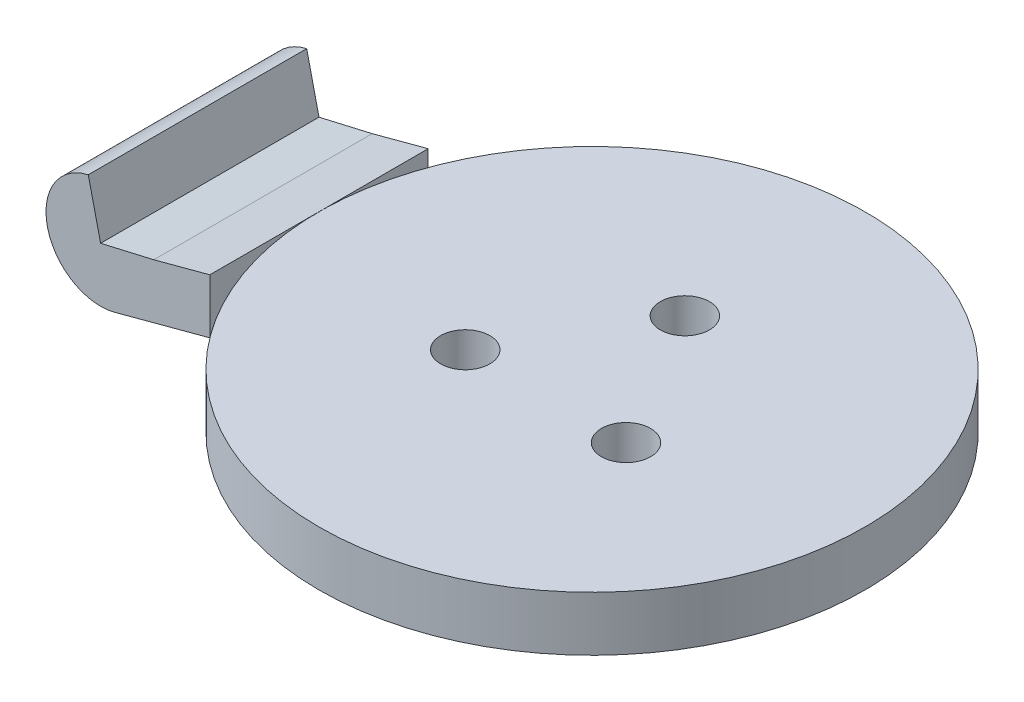
ISO-10303-21;
HEADER;
FILE_DESCRIPTION(('STEP AP214'),'2;1');
FILE_NAME('part.step','',(''),(''),'','','');
FILE_SCHEMA(('AUTOMOTIVE_DESIGN { 1 0 10303 214 1 1 1 1 }'));
ENDSEC;
DATA;
#1=APPLICATION_CONTEXT('core data for automotive mechanical design processes');
#2=APPLICATION_PROTOCOL_DEFINITION('international standard','automotive_design',2000,#1);
#3=PRODUCT_CONTEXT('',#1,'mechanical');
#4=PRODUCT('Part','Part','',(#3));
#5=PRODUCT_RELATED_PRODUCT_CATEGORY('part','',(#4));
#6=PRODUCT_DEFINITION_FORMATION('','',#4);
#7=PRODUCT_DEFINITION_CONTEXT('part definition',#1,'design');
#8=PRODUCT_DEFINITION('design','',#6,#7);
#9=PRODUCT_DEFINITION_SHAPE('','',#8);
#10=(LENGTH_UNIT() NAMED_UNIT(*) SI_UNIT(.MILLI.,.METRE.));
#11=(NAMED_UNIT(*) PLANE_ANGLE_UNIT() SI_UNIT($,.RADIAN.));
#12=(NAMED_UNIT(*) SI_UNIT($,.STERADIAN.) SOLID_ANGLE_UNIT());
#13=UNCERTAINTY_MEASURE_WITH_UNIT(LENGTH_MEASURE(1.E-05),#10,'distance_accuracy_value','');
#14=(GEOMETRIC_REPRESENTATION_CONTEXT(3) GLOBAL_UNCERTAINTY_ASSIGNED_CONTEXT((#13)) GLOBAL_UNIT_ASSIGNED_CONTEXT((#10,
#11,#12)) REPRESENTATION_CONTEXT('',''));
#15=CARTESIAN_POINT('',(0.,0.,0.));
#16=DIRECTION('',(0.,0.,1.));
#17=DIRECTION('',(1.,0.,0.));
#18=AXIS2_PLACEMENT_3D('',#15,#16,#17);
#19=CARTESIAN_POINT('',(-35.,0.,10.));
#20=DIRECTION('',(0.,0.,-1.));
#21=DIRECTION('',(-1.,0.,0.));
#22=AXIS2_PLACEMENT_3D('',#19,#20,#21);
#23=CYLINDRICAL_SURFACE('',#22,5.);
#24=CARTESIAN_POINT('',(-35.,0.,10.));
#25=DIRECTION('',(0.,0.,1.));
#26=DIRECTION('',(1.,0.,0.));
#27=AXIS2_PLACEMENT_3D('',#24,#25,#26);
#28=CIRCLE('',#27,5.);
#29=CARTESIAN_POINT('',(-36.1275743998344,4.87119861767492,10.));
#30=VERTEX_POINT('',#29);
#31=CARTESIAN_POINT('',(-33.7075150810188,-4.83006032407528,10.));
#32=VERTEX_POINT('',#31);
#33=EDGE_CURVE('E12',#30,#32,#28,.T.);
#34=ORIENTED_EDGE('',*,*,#33,.F.);
#35=DIRECTION('',(0.,0.,-1.));
#36=VECTOR('',#35,1.);
#37=CARTESIAN_POINT('',(-36.1275743998344,4.87119861767492,25.));
#38=LINE('',#37,#36);
#39=CARTESIAN_POINT('',(-36.1275743998344,4.87119861767492,-10.));
#40=VERTEX_POINT('',#39);
#41=EDGE_CURVE('E115',#30,#40,#38,.T.);
#42=ORIENTED_EDGE('',*,*,#41,.T.);
#43=CARTESIAN_POINT('',(-35.,0.,-10.));
#44=DIRECTION('',(0.,0.,1.));
#45=DIRECTION('',(1.,0.,0.));
#46=AXIS2_PLACEMENT_3D('',#43,#44,#45);
#47=CIRCLE('',#46,5.);
#48=CARTESIAN_POINT('',(-33.7075150810188,-4.83006032407528,-10.));
#49=VERTEX_POINT('',#48);
#50=EDGE_CURVE('E50',#40,#49,#47,.T.);
#51=ORIENTED_EDGE('',*,*,#50,.T.);
#52=DIRECTION('',(0.,0.,-1.));
#53=VECTOR('',#52,1.);
#54=CARTESIAN_POINT('',(-33.7075150810188,-4.83006032407528,21.3820298383352));
#55=LINE('',#54,#53);
#56=EDGE_CURVE('E140',#32,#49,#55,.T.);
#57=ORIENTED_EDGE('',*,*,#56,.F.);
#58=EDGE_LOOP('',(#34,#42,#51,#57));
#59=FACE_BOUND('',#58,.T.);
#60=ADVANCED_FACE('F47',(#59),#23,.T.);
#61=CARTESIAN_POINT('',(-35.,0.,10.));
#62=DIRECTION('',(0.,0.,1.));
#63=DIRECTION('',(1.,0.,0.));
#64=AXIS2_PLACEMENT_3D('',#61,#62,#63);
#65=PLANE('',#64);
#66=DIRECTION('',(0.974239723534984,0.225514879966884,0.));
#67=VECTOR('',#66,1.);
#68=CARTESIAN_POINT('',(-35.,0.,10.));
#69=LINE('',#68,#67);
#70=CARTESIAN_POINT('',(-35.,0.,10.));
#71=VERTEX_POINT('',#70);
#72=CARTESIAN_POINT('',(-30.1288013823251,1.12757439983442,10.));
#73=VERTEX_POINT('',#72);
#74=EDGE_CURVE('E61',#71,#73,#69,.T.);
#75=ORIENTED_EDGE('',*,*,#74,.F.);
#76=DIRECTION('',(0.225514879966882,-0.974239723534985,0.));
#77=VECTOR('',#76,1.);
#78=CARTESIAN_POINT('',(-35.,0.,10.));
#79=LINE('',#78,#77);
#80=EDGE_CURVE('E114',#30,#71,#79,.T.);
#81=ORIENTED_EDGE('',*,*,#80,.F.);
#82=ORIENTED_EDGE('',*,*,#33,.T.);
#83=DIRECTION('',(-0.966012064815056,-0.258496983796236,0.));
#84=VECTOR('',#83,1.);
#85=CARTESIAN_POINT('',(-25.,-2.5,10.));
#86=LINE('',#85,#84);
#87=CARTESIAN_POINT('',(-25.,-2.5,10.));
#88=VERTEX_POINT('',#87);
#89=EDGE_CURVE('E91',#88,#32,#86,.T.);
#90=ORIENTED_EDGE('',*,*,#89,.F.);
#91=DIRECTION('',(0.,-1.,0.));
#92=VECTOR('',#91,1.);
#93=CARTESIAN_POINT('',(-25.,2.5,10.));
#94=LINE('',#93,#92);
#95=CARTESIAN_POINT('',(-25.,2.5,10.));
#96=VERTEX_POINT('',#95);
#97=EDGE_CURVE('E131',#96,#88,#94,.T.);
#98=ORIENTED_EDGE('',*,*,#97,.F.);
#99=DIRECTION('',(0.966012064815056,0.258496983796235,0.));
#100=VECTOR('',#99,1.);
#101=CARTESIAN_POINT('',(-33.7075150810188,0.169939675924723,10.));
#102=LINE('',#101,#100);
#103=EDGE_CURVE('E84',#73,#96,#102,.T.);
#104=ORIENTED_EDGE('',*,*,#103,.F.);
#105=EDGE_LOOP('',(#75,#81,#82,#90,#98,#104));
#106=FACE_BOUND('',#105,.T.);
#107=ADVANCED_FACE('F156',(#106),#65,.T.);
#108=CARTESIAN_POINT('',(-35.,0.,-10.));
#109=DIRECTION('',(0.,0.,1.));
#110=DIRECTION('',(1.,0.,0.));
#111=AXIS2_PLACEMENT_3D('',#108,#109,#110);
#112=PLANE('',#111);
#113=DIRECTION('',(-0.225514879966882,0.974239723534985,0.));
#114=VECTOR('',#113,1.);
#115=CARTESIAN_POINT('',(-33.2200063619733,-7.6896944009186,-10.));
#116=LINE('',#115,#114);
#117=CARTESIAN_POINT('',(-35.,0.,-10.));
#118=VERTEX_POINT('',#117);
#119=EDGE_CURVE('E111',#118,#40,#116,.T.);
#120=ORIENTED_EDGE('',*,*,#119,.F.);
#121=DIRECTION('',(-0.974239723534984,-0.225514879966884,0.));
#122=VECTOR('',#121,1.);
#123=CARTESIAN_POINT('',(-1.77999363802673,7.68969440091866,-10.));
#124=LINE('',#123,#122);
#125=CARTESIAN_POINT('',(-30.1288013823251,1.12757439983442,-10.));
#126=VERTEX_POINT('',#125);
#127=EDGE_CURVE('E117',#126,#118,#124,.T.);
#128=ORIENTED_EDGE('',*,*,#127,.F.);
#129=DIRECTION('',(0.966012064815056,0.258496983796235,0.));
#130=VECTOR('',#129,1.);
#131=CARTESIAN_POINT('',(-33.7075150810188,0.169939675924723,-10.));
#132=LINE('',#131,#130);
#133=CARTESIAN_POINT('',(-25.,2.5,-10.));
#134=VERTEX_POINT('',#133);
#135=EDGE_CURVE('E70',#126,#134,#132,.T.);
#136=ORIENTED_EDGE('',*,*,#135,.T.);
#137=DIRECTION('',(0.,-1.,0.));
#138=VECTOR('',#137,1.);
#139=CARTESIAN_POINT('',(-25.,2.5,-10.));
#140=LINE('',#139,#138);
#141=CARTESIAN_POINT('',(-25.,-2.5,-10.));
#142=VERTEX_POINT('',#141);
#143=EDGE_CURVE('E132',#134,#142,#140,.T.);
#144=ORIENTED_EDGE('',*,*,#143,.T.);
#145=DIRECTION('',(-0.966012064815056,-0.258496983796236,0.));
#146=VECTOR('',#145,1.);
#147=CARTESIAN_POINT('',(-25.,-2.5,-10.));
#148=LINE('',#147,#146);
#149=EDGE_CURVE('E129',#142,#49,#148,.T.);
#150=ORIENTED_EDGE('',*,*,#149,.T.);
#151=ORIENTED_EDGE('',*,*,#50,.F.);
#152=EDGE_LOOP('',(#120,#128,#136,#144,#150,#151));
#153=FACE_BOUND('',#152,.T.);
#154=ADVANCED_FACE('F122',(#153),#112,.F.);
#155=CARTESIAN_POINT('',(-33.7075150810188,0.169939675924723,21.3820298383352));
#156=DIRECTION('',(-0.258496983796235,0.966012064815056,0.));
#157=DIRECTION('',(-0.966012064815056,-0.258496983796235,0.));
#158=AXIS2_PLACEMENT_3D('',#155,#156,#157);
#159=PLANE('',#158);
#160=DIRECTION('',(0.,0.,-1.));
#161=VECTOR('',#160,1.);
#162=CARTESIAN_POINT('',(-30.1288013823251,1.12757439983442,10.));
#163=LINE('',#162,#161);
#164=EDGE_CURVE('E119',#73,#126,#163,.T.);
#165=ORIENTED_EDGE('',*,*,#164,.F.);
#166=ORIENTED_EDGE('',*,*,#103,.T.);
#167=DIRECTION('',(0.,0.,-1.));
#168=VECTOR('',#167,1.);
#169=CARTESIAN_POINT('',(-25.,2.5,21.3820298383352));
#170=LINE('',#169,#168);
#171=EDGE_CURVE('E139',#96,#134,#170,.T.);
#172=ORIENTED_EDGE('',*,*,#171,.T.);
#173=ORIENTED_EDGE('',*,*,#135,.F.);
#174=EDGE_LOOP('',(#165,#166,#172,#173));
#175=FACE_BOUND('',#174,.T.);
#176=ADVANCED_FACE('F163',(#175),#159,.T.);
#177=CARTESIAN_POINT('',(-25.,2.5,21.3820298383352));
#178=DIRECTION('',(1.,0.,0.));
#179=DIRECTION('',(0.,0.,-1.));
#180=AXIS2_PLACEMENT_3D('',#177,#178,#179);
#181=PLANE('',#180);
#182=ORIENTED_EDGE('',*,*,#171,.F.);
#183=ORIENTED_EDGE('',*,*,#97,.T.);
#184=DIRECTION('',(0.,0.,-1.));
#185=VECTOR('',#184,1.);
#186=CARTESIAN_POINT('',(-25.,-2.5,21.3820298383352));
#187=LINE('',#186,#185);
#188=EDGE_CURVE('E137',#88,#142,#187,.T.);
#189=ORIENTED_EDGE('',*,*,#188,.T.);
#190=ORIENTED_EDGE('',*,*,#143,.F.);
#191=EDGE_LOOP('',(#182,#183,#189,#190));
#192=FACE_BOUND('',#191,.T.);
#193=ADVANCED_FACE('F155',(#192),#181,.T.);
#194=CARTESIAN_POINT('',(-25.,-2.5,21.3820298383352));
#195=DIRECTION('',(0.258496983796236,-0.966012064815056,0.));
#196=DIRECTION('',(0.966012064815056,0.258496983796236,0.));
#197=AXIS2_PLACEMENT_3D('',#194,#195,#196);
#198=PLANE('',#197);
#199=ORIENTED_EDGE('',*,*,#188,.F.);
#200=ORIENTED_EDGE('',*,*,#89,.T.);
#201=ORIENTED_EDGE('',*,*,#56,.T.);
#202=ORIENTED_EDGE('',*,*,#149,.F.);
#203=EDGE_LOOP('',(#199,#200,#201,#202));
#204=FACE_BOUND('',#203,.T.);
#205=ADVANCED_FACE('F151',(#204),#198,.T.);
#206=CARTESIAN_POINT('',(-1.77999363802673,7.68969440091866,25.));
#207=DIRECTION('',(0.225514879966884,-0.974239723534984,0.));
#208=DIRECTION('',(0.974239723534984,0.225514879966884,0.));
#209=AXIS2_PLACEMENT_3D('',#206,#207,#208);
#210=PLANE('',#209);
#211=ORIENTED_EDGE('',*,*,#74,.T.);
#212=ORIENTED_EDGE('',*,*,#164,.T.);
#213=ORIENTED_EDGE('',*,*,#127,.T.);
#214=DIRECTION('',(0.,0.,-1.));
#215=VECTOR('',#214,1.);
#216=CARTESIAN_POINT('',(-35.,0.,25.));
#217=LINE('',#216,#215);
#218=EDGE_CURVE('E107',#71,#118,#217,.T.);
#219=ORIENTED_EDGE('',*,*,#218,.F.);
#220=EDGE_LOOP('',(#211,#212,#213,#219));
#221=FACE_BOUND('',#220,.T.);
#222=ADVANCED_FACE('F118',(#221),#210,.F.);
#223=CARTESIAN_POINT('',(-33.2200063619733,-7.6896944009186,25.));
#224=DIRECTION('',(-0.974239723534984,-0.225514879966882,0.));
#225=DIRECTION('',(0.225514879966882,-0.974239723534985,0.));
#226=AXIS2_PLACEMENT_3D('',#223,#224,#225);
#227=PLANE('',#226);
#228=ORIENTED_EDGE('',*,*,#80,.T.);
#229=ORIENTED_EDGE('',*,*,#218,.T.);
#230=ORIENTED_EDGE('',*,*,#119,.T.);
#231=ORIENTED_EDGE('',*,*,#41,.F.);
#232=EDGE_LOOP('',(#228,#229,#230,#231));
#233=FACE_BOUND('',#232,.T.);
#234=ADVANCED_FACE('F109',(#233),#227,.F.);
#235=CLOSED_SHELL('',(#60,#107,#154,#176,#193,#205,#222,#234));
#236=MANIFOLD_SOLID_BREP('B2',#235);
#237=CARTESIAN_POINT('',(0.,2.5,0.));
#238=DIRECTION('',(0.,1.,0.));
#239=DIRECTION('',(0.,0.,1.));
#240=AXIS2_PLACEMENT_3D('',#237,#238,#239);
#241=PLANE('',#240);
#242=CARTESIAN_POINT('',(7.36121593216773,2.5,4.25));
#243=DIRECTION('',(0.,1.,0.));
#244=DIRECTION('',(0.,0.,1.));
#245=AXIS2_PLACEMENT_3D('',#242,#243,#244);
#246=CIRCLE('',#245,2.25000000000004);
#247=CARTESIAN_POINT('',(7.36121593216773,2.5,6.50000000000004));
#248=VERTEX_POINT('',#247);
#249=EDGE_CURVE('E248',#248,#248,#246,.T.);
#250=ORIENTED_EDGE('',*,*,#249,.F.);
#251=EDGE_LOOP('',(#250));
#252=FACE_BOUND('',#251,.T.);
#253=CARTESIAN_POINT('',(0.,2.5,0.));
#254=DIRECTION('',(0.,1.,0.));
#255=DIRECTION('',(0.,0.,1.));
#256=AXIS2_PLACEMENT_3D('',#253,#254,#255);
#257=CIRCLE('',#256,25.);
#258=CARTESIAN_POINT('',(0.,2.5,25.));
#259=VERTEX_POINT('',#258);
#260=EDGE_CURVE('E46',#259,#259,#257,.T.);
#261=ORIENTED_EDGE('',*,*,#260,.T.);
#262=EDGE_LOOP('',(#261));
#263=FACE_BOUND('',#262,.T.);
#264=CARTESIAN_POINT('',(0.,2.5,-8.5));
#265=DIRECTION('',(0.,1.,0.));
#266=DIRECTION('',(0.,0.,1.));
#267=AXIS2_PLACEMENT_3D('',#264,#265,#266);
#268=CIRCLE('',#267,2.25);
#269=CARTESIAN_POINT('',(0.,2.5,-6.25));
#270=VERTEX_POINT('',#269);
#271=EDGE_CURVE('E242',#270,#270,#268,.T.);
#272=ORIENTED_EDGE('',*,*,#271,.F.);
#273=EDGE_LOOP('',(#272));
#274=FACE_BOUND('',#273,.T.);
#275=CARTESIAN_POINT('',(-7.36121593216773,2.5,4.25));
#276=DIRECTION('',(0.,1.,0.));
#277=DIRECTION('',(0.,0.,1.));
#278=AXIS2_PLACEMENT_3D('',#275,#276,#277);
#279=CIRCLE('',#278,2.25000000000008);
#280=CARTESIAN_POINT('',(-7.36121593216773,2.5,6.50000000000008));
#281=VERTEX_POINT('',#280);
#282=EDGE_CURVE('E256',#281,#281,#279,.T.);
#283=ORIENTED_EDGE('',*,*,#282,.F.);
#284=EDGE_LOOP('',(#283));
#285=FACE_BOUND('',#284,.T.);
#286=ADVANCED_FACE('F229',(#252,#263,#274,#285),#241,.T.);
#287=CARTESIAN_POINT('',(0.,-2.5,0.));
#288=DIRECTION('',(0.,1.,0.));
#289=DIRECTION('',(0.,0.,1.));
#290=AXIS2_PLACEMENT_3D('',#287,#288,#289);
#291=PLANE('',#290);
#292=CARTESIAN_POINT('',(0.,-2.5,0.));
#293=DIRECTION('',(0.,1.,0.));
#294=DIRECTION('',(0.,0.,1.));
#295=AXIS2_PLACEMENT_3D('',#292,#293,#294);
#296=CIRCLE('',#295,25.);
#297=CARTESIAN_POINT('',(0.,-2.5,25.));
#298=VERTEX_POINT('',#297);
#299=EDGE_CURVE('E233',#298,#298,#296,.T.);
#300=ORIENTED_EDGE('',*,*,#299,.F.);
#301=EDGE_LOOP('',(#300));
#302=FACE_BOUND('',#301,.T.);
#303=CARTESIAN_POINT('',(0.,-2.5,-8.5));
#304=DIRECTION('',(0.,1.,0.));
#305=DIRECTION('',(0.,0.,1.));
#306=AXIS2_PLACEMENT_3D('',#303,#304,#305);
#307=CIRCLE('',#306,2.25);
#308=CARTESIAN_POINT('',(0.,-2.5,-6.25));
#309=VERTEX_POINT('',#308);
#310=EDGE_CURVE('E244',#309,#309,#307,.T.);
#311=ORIENTED_EDGE('',*,*,#310,.T.);
#312=EDGE_LOOP('',(#311));
#313=FACE_BOUND('',#312,.T.);
#314=CARTESIAN_POINT('',(7.36121593216773,-2.5,4.25));
#315=DIRECTION('',(0.,1.,0.));
#316=DIRECTION('',(0.,0.,1.));
#317=AXIS2_PLACEMENT_3D('',#314,#315,#316);
#318=CIRCLE('',#317,2.25000000000004);
#319=CARTESIAN_POINT('',(7.36121593216773,-2.5,6.50000000000004));
#320=VERTEX_POINT('',#319);
#321=EDGE_CURVE('E252',#320,#320,#318,.T.);
#322=ORIENTED_EDGE('',*,*,#321,.T.);
#323=EDGE_LOOP('',(#322));
#324=FACE_BOUND('',#323,.T.);
#325=CARTESIAN_POINT('',(-7.36121593216773,-2.5,4.25));
#326=DIRECTION('',(0.,1.,0.));
#327=DIRECTION('',(0.,0.,1.));
#328=AXIS2_PLACEMENT_3D('',#325,#326,#327);
#329=CIRCLE('',#328,2.25000000000008);
#330=CARTESIAN_POINT('',(-7.36121593216773,-2.5,6.50000000000008));
#331=VERTEX_POINT('',#330);
#332=EDGE_CURVE('E260',#331,#331,#329,.T.);
#333=ORIENTED_EDGE('',*,*,#332,.T.);
#334=EDGE_LOOP('',(#333));
#335=FACE_BOUND('',#334,.T.);
#336=ADVANCED_FACE('F272',(#302,#313,#324,#335),#291,.F.);
#337=CARTESIAN_POINT('',(0.,2.5,0.));
#338=DIRECTION('',(0.,-1.,0.));
#339=DIRECTION('',(0.,0.,-1.));
#340=AXIS2_PLACEMENT_3D('',#337,#338,#339);
#341=CYLINDRICAL_SURFACE('',#340,25.);
#342=ORIENTED_EDGE('',*,*,#299,.T.);
#343=EDGE_LOOP('',(#342));
#344=FACE_BOUND('',#343,.T.);
#345=ORIENTED_EDGE('',*,*,#260,.F.);
#346=EDGE_LOOP('',(#345));
#347=FACE_BOUND('',#346,.T.);
#348=ADVANCED_FACE('F231',(#344,#347),#341,.T.);
#349=CARTESIAN_POINT('',(0.,2.5,-8.5));
#350=DIRECTION('',(0.,-1.,0.));
#351=DIRECTION('',(0.,0.,-1.));
#352=AXIS2_PLACEMENT_3D('',#349,#350,#351);
#353=CYLINDRICAL_SURFACE('',#352,2.25);
#354=ORIENTED_EDGE('',*,*,#271,.T.);
#355=EDGE_LOOP('',(#354));
#356=FACE_BOUND('',#355,.T.);
#357=ORIENTED_EDGE('',*,*,#310,.F.);
#358=EDGE_LOOP('',(#357));
#359=FACE_BOUND('',#358,.T.);
#360=ADVANCED_FACE('F281',(#356,#359),#353,.F.);
#361=CARTESIAN_POINT('',(7.36121593216773,2.5,4.25));
#362=DIRECTION('',(0.,-1.,0.));
#363=DIRECTION('',(0.,0.,-1.));
#364=AXIS2_PLACEMENT_3D('',#361,#362,#363);
#365=CYLINDRICAL_SURFACE('',#364,2.25000000000004);
#366=ORIENTED_EDGE('',*,*,#249,.T.);
#367=EDGE_LOOP('',(#366));
#368=FACE_BOUND('',#367,.T.);
#369=ORIENTED_EDGE('',*,*,#321,.F.);
#370=EDGE_LOOP('',(#369));
#371=FACE_BOUND('',#370,.T.);
#372=ADVANCED_FACE('F284',(#368,#371),#365,.F.);
#373=CARTESIAN_POINT('',(-7.36121593216773,2.5,4.25));
#374=DIRECTION('',(0.,-1.,0.));
#375=DIRECTION('',(0.,0.,-1.));
#376=AXIS2_PLACEMENT_3D('',#373,#374,#375);
#377=CYLINDRICAL_SURFACE('',#376,2.25000000000008);
#378=ORIENTED_EDGE('',*,*,#282,.T.);
#379=EDGE_LOOP('',(#378));
#380=FACE_BOUND('',#379,.T.);
#381=ORIENTED_EDGE('',*,*,#332,.F.);
#382=EDGE_LOOP('',(#381));
#383=FACE_BOUND('',#382,.T.);
#384=ADVANCED_FACE('F268',(#380,#383),#377,.F.);
#385=CLOSED_SHELL('',(#286,#336,#348,#360,#372,#384));
#386=MANIFOLD_SOLID_BREP('B6',#385);
#387=ADVANCED_BREP_SHAPE_REPRESENTATION('',(#18,#236,#386),#14);
#388=SHAPE_DEFINITION_REPRESENTATION(#9,#387);
ENDSEC;
END-ISO-10303-21;
